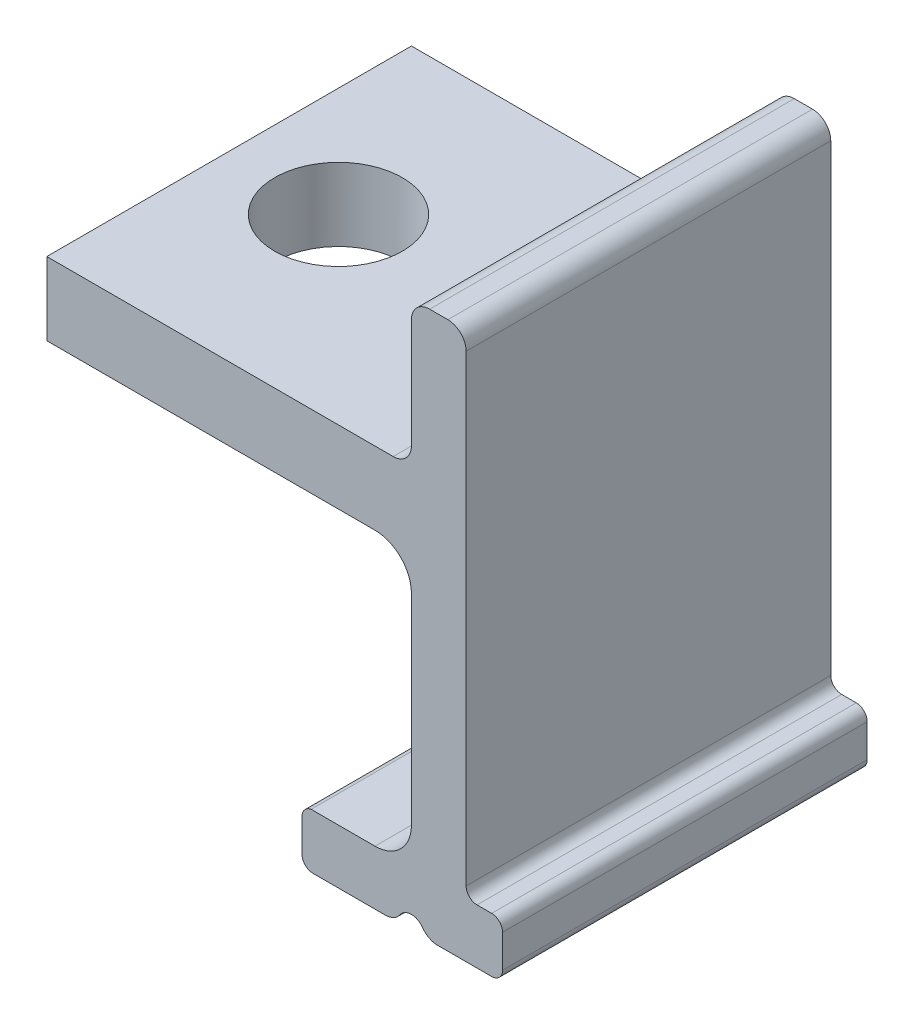
ISO-10303-21;
HEADER;
FILE_DESCRIPTION(('STEP AP214'),'2;1');
FILE_NAME('part.step','',(''),(''),'','','');
FILE_SCHEMA(('AUTOMOTIVE_DESIGN { 1 0 10303 214 1 1 1 1 }'));
ENDSEC;
DATA;
#1=APPLICATION_CONTEXT('core data for automotive mechanical design processes');
#2=APPLICATION_PROTOCOL_DEFINITION('international standard','automotive_design',2000,#1);
#3=PRODUCT_CONTEXT('',#1,'mechanical');
#4=PRODUCT('Part','Part','',(#3));
#5=PRODUCT_RELATED_PRODUCT_CATEGORY('part','',(#4));
#6=PRODUCT_DEFINITION_FORMATION('','',#4);
#7=PRODUCT_DEFINITION_CONTEXT('part definition',#1,'design');
#8=PRODUCT_DEFINITION('design','',#6,#7);
#9=PRODUCT_DEFINITION_SHAPE('','',#8);
#10=(LENGTH_UNIT() NAMED_UNIT(*) SI_UNIT(.MILLI.,.METRE.));
#11=(NAMED_UNIT(*) PLANE_ANGLE_UNIT() SI_UNIT($,.RADIAN.));
#12=(NAMED_UNIT(*) SI_UNIT($,.STERADIAN.) SOLID_ANGLE_UNIT());
#13=UNCERTAINTY_MEASURE_WITH_UNIT(LENGTH_MEASURE(1.E-05),#10,'distance_accuracy_value','');
#14=(GEOMETRIC_REPRESENTATION_CONTEXT(3) GLOBAL_UNCERTAINTY_ASSIGNED_CONTEXT((#13)) GLOBAL_UNIT_ASSIGNED_CONTEXT((#10,
#11,#12)) REPRESENTATION_CONTEXT('',''));
#15=CARTESIAN_POINT('',(0.,0.,0.));
#16=DIRECTION('',(0.,0.,1.));
#17=DIRECTION('',(1.,0.,0.));
#18=AXIS2_PLACEMENT_3D('',#15,#16,#17);
#19=CARTESIAN_POINT('',(0.,-2.,10.));
#20=DIRECTION('',(1.,0.,0.));
#21=DIRECTION('',(0.,0.,-1.));
#22=AXIS2_PLACEMENT_3D('',#19,#20,#21);
#23=PLANE('',#22);
#24=DIRECTION('',(0.,-1.,0.));
#25=VECTOR('',#24,1.);
#26=CARTESIAN_POINT('',(0.,-2.,0.));
#27=LINE('',#26,#25);
#28=CARTESIAN_POINT('',(0.,0.,0.));
#29=VERTEX_POINT('',#28);
#30=CARTESIAN_POINT('',(0.,-2.,0.));
#31=VERTEX_POINT('',#30);
#32=EDGE_CURVE('E241',#29,#31,#27,.T.);
#33=ORIENTED_EDGE('',*,*,#32,.T.);
#34=DIRECTION('',(0.,0.,-1.));
#35=VECTOR('',#34,1.);
#36=CARTESIAN_POINT('',(0.,-2.,10.));
#37=LINE('',#36,#35);
#38=CARTESIAN_POINT('',(0.,-2.,10.));
#39=VERTEX_POINT('',#38);
#40=EDGE_CURVE('E229',#39,#31,#37,.T.);
#41=ORIENTED_EDGE('',*,*,#40,.F.);
#42=DIRECTION('',(0.,-1.,0.));
#43=VECTOR('',#42,1.);
#44=CARTESIAN_POINT('',(0.,-2.,10.));
#45=LINE('',#44,#43);
#46=CARTESIAN_POINT('',(0.,0.,10.));
#47=VERTEX_POINT('',#46);
#48=EDGE_CURVE('E278',#47,#39,#45,.T.);
#49=ORIENTED_EDGE('',*,*,#48,.F.);
#50=DIRECTION('',(0.,0.,-1.));
#51=VECTOR('',#50,1.);
#52=CARTESIAN_POINT('',(0.,0.,10.));
#53=LINE('',#52,#51);
#54=EDGE_CURVE('E279',#47,#29,#53,.T.);
#55=ORIENTED_EDGE('',*,*,#54,.T.);
#56=EDGE_LOOP('',(#33,#41,#49,#55));
#57=FACE_BOUND('',#56,.T.);
#58=ADVANCED_FACE('F38',(#57),#23,.F.);
#59=CARTESIAN_POINT('',(7.3,-2.,10.));
#60=DIRECTION('',(0.,1.,0.));
#61=DIRECTION('',(-1.,0.,0.));
#62=AXIS2_PLACEMENT_3D('',#59,#60,#61);
#63=PLANE('',#62);
#64=CARTESIAN_POINT('',(3.00000000000038,-2.,4.99999999999996));
#65=DIRECTION('',(0.,1.,0.));
#66=DIRECTION('',(-1.,0.,0.));
#67=AXIS2_PLACEMENT_3D('',#64,#65,#66);
#68=CIRCLE('',#67,1.75);
#69=CARTESIAN_POINT('',(1.25000000000038,-2.,4.99999999999996));
#70=VERTEX_POINT('',#69);
#71=EDGE_CURVE('E400',#70,#70,#68,.T.);
#72=ORIENTED_EDGE('',*,*,#71,.T.);
#73=EDGE_LOOP('',(#72));
#74=FACE_BOUND('',#73,.T.);
#75=DIRECTION('',(1.,0.,0.));
#76=VECTOR('',#75,1.);
#77=CARTESIAN_POINT('',(7.3,-2.,0.));
#78=LINE('',#77,#76);
#79=CARTESIAN_POINT('',(9.,-2.,0.));
#80=VERTEX_POINT('',#79);
#81=EDGE_CURVE('E237',#31,#80,#78,.T.);
#82=ORIENTED_EDGE('',*,*,#81,.T.);
#83=DIRECTION('',(0.,0.,1.));
#84=VECTOR('',#83,1.);
#85=CARTESIAN_POINT('',(9.,-2.,0.));
#86=LINE('',#85,#84);
#87=CARTESIAN_POINT('',(9.,-2.,10.));
#88=VERTEX_POINT('',#87);
#89=EDGE_CURVE('E410',#80,#88,#86,.T.);
#90=ORIENTED_EDGE('',*,*,#89,.T.);
#91=DIRECTION('',(1.,0.,0.));
#92=VECTOR('',#91,1.);
#93=CARTESIAN_POINT('',(7.3,-2.,10.));
#94=LINE('',#93,#92);
#95=EDGE_CURVE('E371',#39,#88,#94,.T.);
#96=ORIENTED_EDGE('',*,*,#95,.F.);
#97=ORIENTED_EDGE('',*,*,#40,.T.);
#98=EDGE_LOOP('',(#82,#90,#96,#97));
#99=FACE_BOUND('',#98,.T.);
#100=ADVANCED_FACE('F422',(#74,#99),#63,.F.);
#101=CARTESIAN_POINT('',(7.3,-9.8,10.));
#102=DIRECTION('',(0.,0.,-1.));
#103=DIRECTION('',(-1.,0.,0.));
#104=AXIS2_PLACEMENT_3D('',#101,#102,#103);
#105=CYLINDRICAL_SURFACE('',#104,0.3);
#106=CARTESIAN_POINT('',(7.3,-9.8,0.));
#107=DIRECTION('',(0.,0.,1.));
#108=DIRECTION('',(-1.,0.,0.));
#109=AXIS2_PLACEMENT_3D('',#106,#107,#108);
#110=CIRCLE('',#109,0.3);
#111=CARTESIAN_POINT('',(7.25,-9.50419601084502,0.));
#112=VERTEX_POINT('',#111);
#113=CARTESIAN_POINT('',(7.,-9.8,0.));
#114=VERTEX_POINT('',#113);
#115=EDGE_CURVE('E226',#112,#114,#110,.T.);
#116=ORIENTED_EDGE('',*,*,#115,.T.);
#117=DIRECTION('',(0.,0.,-1.));
#118=VECTOR('',#117,1.);
#119=CARTESIAN_POINT('',(7.,-9.8,10.));
#120=LINE('',#119,#118);
#121=CARTESIAN_POINT('',(7.,-9.8,10.));
#122=VERTEX_POINT('',#121);
#123=EDGE_CURVE('E230',#122,#114,#120,.T.);
#124=ORIENTED_EDGE('',*,*,#123,.F.);
#125=CARTESIAN_POINT('',(7.3,-9.8,10.));
#126=DIRECTION('',(0.,0.,1.));
#127=DIRECTION('',(-1.,0.,0.));
#128=AXIS2_PLACEMENT_3D('',#125,#126,#127);
#129=CIRCLE('',#128,0.3);
#130=CARTESIAN_POINT('',(7.25,-9.50419601084502,10.));
#131=VERTEX_POINT('',#130);
#132=EDGE_CURVE('E228',#131,#122,#129,.T.);
#133=ORIENTED_EDGE('',*,*,#132,.F.);
#134=DIRECTION('',(0.,0.,-1.));
#135=VECTOR('',#134,1.);
#136=CARTESIAN_POINT('',(7.25,-9.50419601084502,10.));
#137=LINE('',#136,#135);
#138=EDGE_CURVE('E215',#131,#112,#137,.T.);
#139=ORIENTED_EDGE('',*,*,#138,.T.);
#140=EDGE_LOOP('',(#116,#124,#133,#139));
#141=FACE_BOUND('',#140,.T.);
#142=ADVANCED_FACE('F224',(#141),#105,.T.);
#143=CARTESIAN_POINT('',(7.,-9.8,10.));
#144=DIRECTION('',(1.,0.,0.));
#145=DIRECTION('',(0.,0.,-1.));
#146=AXIS2_PLACEMENT_3D('',#143,#144,#145);
#147=PLANE('',#146);
#148=DIRECTION('',(0.,-1.,0.));
#149=VECTOR('',#148,1.);
#150=CARTESIAN_POINT('',(7.,-9.8,0.));
#151=LINE('',#150,#149);
#152=CARTESIAN_POINT('',(7.,-10.7,0.));
#153=VERTEX_POINT('',#152);
#154=EDGE_CURVE('E236',#114,#153,#151,.T.);
#155=ORIENTED_EDGE('',*,*,#154,.T.);
#156=DIRECTION('',(0.,0.,-1.));
#157=VECTOR('',#156,1.);
#158=CARTESIAN_POINT('',(7.,-10.7,10.));
#159=LINE('',#158,#157);
#160=CARTESIAN_POINT('',(7.,-10.7,10.));
#161=VERTEX_POINT('',#160);
#162=EDGE_CURVE('E322',#161,#153,#159,.T.);
#163=ORIENTED_EDGE('',*,*,#162,.F.);
#164=DIRECTION('',(0.,-1.,0.));
#165=VECTOR('',#164,1.);
#166=CARTESIAN_POINT('',(7.,-9.8,10.));
#167=LINE('',#166,#165);
#168=EDGE_CURVE('E368',#122,#161,#167,.T.);
#169=ORIENTED_EDGE('',*,*,#168,.F.);
#170=ORIENTED_EDGE('',*,*,#123,.T.);
#171=EDGE_LOOP('',(#155,#163,#169,#170));
#172=FACE_BOUND('',#171,.T.);
#173=ADVANCED_FACE('F367',(#172),#147,.F.);
#174=CARTESIAN_POINT('',(7.3,-10.7,10.));
#175=DIRECTION('',(0.,0.,-1.));
#176=DIRECTION('',(-1.,0.,0.));
#177=AXIS2_PLACEMENT_3D('',#174,#175,#176);
#178=CYLINDRICAL_SURFACE('',#177,0.299999999999999);
#179=CARTESIAN_POINT('',(7.3,-10.7,0.));
#180=DIRECTION('',(0.,0.,1.));
#181=DIRECTION('',(-1.,0.,0.));
#182=AXIS2_PLACEMENT_3D('',#179,#180,#181);
#183=CIRCLE('',#182,0.299999999999999);
#184=CARTESIAN_POINT('',(7.3,-11.,0.));
#185=VERTEX_POINT('',#184);
#186=EDGE_CURVE('E239',#153,#185,#183,.T.);
#187=ORIENTED_EDGE('',*,*,#186,.T.);
#188=DIRECTION('',(0.,0.,-1.));
#189=VECTOR('',#188,1.);
#190=CARTESIAN_POINT('',(7.3,-11.,10.));
#191=LINE('',#190,#189);
#192=CARTESIAN_POINT('',(7.3,-11.,10.));
#193=VERTEX_POINT('',#192);
#194=EDGE_CURVE('E319',#193,#185,#191,.T.);
#195=ORIENTED_EDGE('',*,*,#194,.F.);
#196=CARTESIAN_POINT('',(7.3,-10.7,10.));
#197=DIRECTION('',(0.,0.,1.));
#198=DIRECTION('',(-1.,0.,0.));
#199=AXIS2_PLACEMENT_3D('',#196,#197,#198);
#200=CIRCLE('',#199,0.299999999999999);
#201=EDGE_CURVE('E363',#161,#193,#200,.T.);
#202=ORIENTED_EDGE('',*,*,#201,.F.);
#203=ORIENTED_EDGE('',*,*,#162,.T.);
#204=EDGE_LOOP('',(#187,#195,#202,#203));
#205=FACE_BOUND('',#204,.T.);
#206=ADVANCED_FACE('F362',(#205),#178,.T.);
#207=CARTESIAN_POINT('',(9.625,-11.,10.));
#208=DIRECTION('',(0.,1.,0.));
#209=DIRECTION('',(0.,0.,1.));
#210=AXIS2_PLACEMENT_3D('',#207,#208,#209);
#211=PLANE('',#210);
#212=DIRECTION('',(1.,0.,0.));
#213=VECTOR('',#212,1.);
#214=CARTESIAN_POINT('',(9.625,-11.,0.));
#215=LINE('',#214,#213);
#216=CARTESIAN_POINT('',(9.28192966918275,-11.,0.));
#217=VERTEX_POINT('',#216);
#218=EDGE_CURVE('E246',#185,#217,#215,.T.);
#219=ORIENTED_EDGE('',*,*,#218,.T.);
#220=DIRECTION('',(0.,0.,-1.));
#221=VECTOR('',#220,1.);
#222=CARTESIAN_POINT('',(9.28192966918275,-11.,10.));
#223=LINE('',#222,#221);
#224=CARTESIAN_POINT('',(9.28192966918275,-11.,10.));
#225=VERTEX_POINT('',#224);
#226=EDGE_CURVE('E337',#217,#225,#223,.F.);
#227=ORIENTED_EDGE('',*,*,#226,.T.);
#228=DIRECTION('',(1.,0.,0.));
#229=VECTOR('',#228,1.);
#230=CARTESIAN_POINT('',(9.625,-11.,10.));
#231=LINE('',#230,#229);
#232=EDGE_CURVE('E345',#193,#225,#231,.T.);
#233=ORIENTED_EDGE('',*,*,#232,.F.);
#234=ORIENTED_EDGE('',*,*,#194,.T.);
#235=EDGE_LOOP('',(#219,#227,#233,#234));
#236=FACE_BOUND('',#235,.T.);
#237=ADVANCED_FACE('F358',(#236),#211,.F.);
#238=CARTESIAN_POINT('',(10.,-11.,10.));
#239=DIRECTION('',(0.,0.,-1.));
#240=DIRECTION('',(-1.,0.,0.));
#241=AXIS2_PLACEMENT_3D('',#238,#239,#240);
#242=CYLINDRICAL_SURFACE('',#241,0.375);
#243=CARTESIAN_POINT('',(10.,-11.,10.));
#244=DIRECTION('',(0.,0.,-1.));
#245=DIRECTION('',(1.,0.,0.));
#246=AXIS2_PLACEMENT_3D('',#243,#244,#245);
#247=CIRCLE('',#246,0.375);
#248=CARTESIAN_POINT('',(9.69225557250689,-10.7857142857143,10.));
#249=VERTEX_POINT('',#248);
#250=CARTESIAN_POINT('',(10.3077444274931,-10.7857142857143,10.));
#251=VERTEX_POINT('',#250);
#252=EDGE_CURVE('E343',#249,#251,#247,.T.);
#253=ORIENTED_EDGE('',*,*,#252,.F.);
#254=DIRECTION('',(0.,0.,-1.));
#255=VECTOR('',#254,1.);
#256=CARTESIAN_POINT('',(9.69225557250689,-10.7857142857143,10.));
#257=LINE('',#256,#255);
#258=CARTESIAN_POINT('',(9.69225557250689,-10.7857142857143,0.));
#259=VERTEX_POINT('',#258);
#260=EDGE_CURVE('E330',#249,#259,#257,.T.);
#261=ORIENTED_EDGE('',*,*,#260,.T.);
#262=CARTESIAN_POINT('',(10.,-11.,0.));
#263=DIRECTION('',(0.,0.,-1.));
#264=DIRECTION('',(1.,0.,0.));
#265=AXIS2_PLACEMENT_3D('',#262,#263,#264);
#266=CIRCLE('',#265,0.375);
#267=CARTESIAN_POINT('',(10.3077444274931,-10.7857142857143,0.));
#268=VERTEX_POINT('',#267);
#269=EDGE_CURVE('E249',#259,#268,#266,.T.);
#270=ORIENTED_EDGE('',*,*,#269,.T.);
#271=DIRECTION('',(0.,0.,-1.));
#272=VECTOR('',#271,1.);
#273=CARTESIAN_POINT('',(10.3077444274931,-10.7857142857143,10.));
#274=LINE('',#273,#272);
#275=EDGE_CURVE('E328',#268,#251,#274,.F.);
#276=ORIENTED_EDGE('',*,*,#275,.T.);
#277=EDGE_LOOP('',(#253,#261,#270,#276));
#278=FACE_BOUND('',#277,.T.);
#279=ADVANCED_FACE('F350',(#278),#242,.F.);
#280=CARTESIAN_POINT('',(12.2,-11.,10.));
#281=DIRECTION('',(0.,1.,0.));
#282=DIRECTION('',(-1.,0.,0.));
#283=AXIS2_PLACEMENT_3D('',#280,#281,#282);
#284=PLANE('',#283);
#285=DIRECTION('',(1.,0.,0.));
#286=VECTOR('',#285,1.);
#287=CARTESIAN_POINT('',(12.2,-11.,10.));
#288=LINE('',#287,#286);
#289=CARTESIAN_POINT('',(10.7180703308173,-11.,10.));
#290=VERTEX_POINT('',#289);
#291=CARTESIAN_POINT('',(12.2,-11.,10.));
#292=VERTEX_POINT('',#291);
#293=EDGE_CURVE('E353',#290,#292,#288,.T.);
#294=ORIENTED_EDGE('',*,*,#293,.F.);
#295=DIRECTION('',(0.,0.,-1.));
#296=VECTOR('',#295,1.);
#297=CARTESIAN_POINT('',(10.7180703308173,-11.,10.));
#298=LINE('',#297,#296);
#299=CARTESIAN_POINT('',(10.7180703308173,-11.,0.));
#300=VERTEX_POINT('',#299);
#301=EDGE_CURVE('E11',#290,#300,#298,.T.);
#302=ORIENTED_EDGE('',*,*,#301,.T.);
#303=DIRECTION('',(1.,0.,0.));
#304=VECTOR('',#303,1.);
#305=CARTESIAN_POINT('',(12.2,-11.,0.));
#306=LINE('',#305,#304);
#307=CARTESIAN_POINT('',(12.2,-11.,0.));
#308=VERTEX_POINT('',#307);
#309=EDGE_CURVE('E252',#300,#308,#306,.T.);
#310=ORIENTED_EDGE('',*,*,#309,.T.);
#311=DIRECTION('',(0.,0.,-1.));
#312=VECTOR('',#311,1.);
#313=CARTESIAN_POINT('',(12.2,-11.,10.));
#314=LINE('',#313,#312);
#315=EDGE_CURVE('E316',#292,#308,#314,.T.);
#316=ORIENTED_EDGE('',*,*,#315,.F.);
#317=EDGE_LOOP('',(#294,#302,#310,#316));
#318=FACE_BOUND('',#317,.T.);
#319=ADVANCED_FACE('F527',(#318),#284,.F.);
#320=CARTESIAN_POINT('',(12.2,-10.7,10.));
#321=DIRECTION('',(0.,0.,-1.));
#322=DIRECTION('',(-1.,0.,0.));
#323=AXIS2_PLACEMENT_3D('',#320,#321,#322);
#324=CYLINDRICAL_SURFACE('',#323,0.3);
#325=CARTESIAN_POINT('',(12.2,-10.7,0.));
#326=DIRECTION('',(0.,0.,1.));
#327=DIRECTION('',(-1.,0.,0.));
#328=AXIS2_PLACEMENT_3D('',#325,#326,#327);
#329=CIRCLE('',#328,0.3);
#330=CARTESIAN_POINT('',(12.5,-10.7,0.));
#331=VERTEX_POINT('',#330);
#332=EDGE_CURVE('E254',#308,#331,#329,.T.);
#333=ORIENTED_EDGE('',*,*,#332,.T.);
#334=DIRECTION('',(0.,0.,-1.));
#335=VECTOR('',#334,1.);
#336=CARTESIAN_POINT('',(12.5,-10.7,10.));
#337=LINE('',#336,#335);
#338=CARTESIAN_POINT('',(12.5,-10.7,10.));
#339=VERTEX_POINT('',#338);
#340=EDGE_CURVE('E313',#339,#331,#337,.T.);
#341=ORIENTED_EDGE('',*,*,#340,.F.);
#342=CARTESIAN_POINT('',(12.2,-10.7,10.));
#343=DIRECTION('',(0.,0.,1.));
#344=DIRECTION('',(-1.,0.,0.));
#345=AXIS2_PLACEMENT_3D('',#342,#343,#344);
#346=CIRCLE('',#345,0.3);
#347=EDGE_CURVE('E377',#292,#339,#346,.T.);
#348=ORIENTED_EDGE('',*,*,#347,.F.);
#349=ORIENTED_EDGE('',*,*,#315,.T.);
#350=EDGE_LOOP('',(#333,#341,#348,#349));
#351=FACE_BOUND('',#350,.T.);
#352=ADVANCED_FACE('F523',(#351),#324,.T.);
#353=CARTESIAN_POINT('',(12.5,-10.7,10.));
#354=DIRECTION('',(-1.,0.,0.));
#355=DIRECTION('',(0.,0.,1.));
#356=AXIS2_PLACEMENT_3D('',#353,#354,#355);
#357=PLANE('',#356);
#358=DIRECTION('',(0.,1.,0.));
#359=VECTOR('',#358,1.);
#360=CARTESIAN_POINT('',(12.5,-10.7,0.));
#361=LINE('',#360,#359);
#362=CARTESIAN_POINT('',(12.5,-9.8,0.));
#363=VERTEX_POINT('',#362);
#364=EDGE_CURVE('E256',#331,#363,#361,.T.);
#365=ORIENTED_EDGE('',*,*,#364,.T.);
#366=DIRECTION('',(0.,0.,-1.));
#367=VECTOR('',#366,1.);
#368=CARTESIAN_POINT('',(12.5,-9.8,10.));
#369=LINE('',#368,#367);
#370=CARTESIAN_POINT('',(12.5,-9.8,10.));
#371=VERTEX_POINT('',#370);
#372=EDGE_CURVE('E310',#371,#363,#369,.T.);
#373=ORIENTED_EDGE('',*,*,#372,.F.);
#374=DIRECTION('',(0.,1.,0.));
#375=VECTOR('',#374,1.);
#376=CARTESIAN_POINT('',(12.5,-10.7,10.));
#377=LINE('',#376,#375);
#378=EDGE_CURVE('E379',#339,#371,#377,.T.);
#379=ORIENTED_EDGE('',*,*,#378,.F.);
#380=ORIENTED_EDGE('',*,*,#340,.T.);
#381=EDGE_LOOP('',(#365,#373,#379,#380));
#382=FACE_BOUND('',#381,.T.);
#383=ADVANCED_FACE('F519',(#382),#357,.F.);
#384=CARTESIAN_POINT('',(12.2,-9.8,10.));
#385=DIRECTION('',(0.,0.,-1.));
#386=DIRECTION('',(-1.,0.,0.));
#387=AXIS2_PLACEMENT_3D('',#384,#385,#386);
#388=CYLINDRICAL_SURFACE('',#387,0.3);
#389=CARTESIAN_POINT('',(12.2,-9.8,0.));
#390=DIRECTION('',(0.,0.,1.));
#391=DIRECTION('',(1.,0.,0.));
#392=AXIS2_PLACEMENT_3D('',#389,#390,#391);
#393=CIRCLE('',#392,0.3);
#394=CARTESIAN_POINT('',(12.2,-9.5,0.));
#395=VERTEX_POINT('',#394);
#396=EDGE_CURVE('E258',#363,#395,#393,.T.);
#397=ORIENTED_EDGE('',*,*,#396,.T.);
#398=DIRECTION('',(0.,0.,-1.));
#399=VECTOR('',#398,1.);
#400=CARTESIAN_POINT('',(12.2,-9.5,10.));
#401=LINE('',#400,#399);
#402=CARTESIAN_POINT('',(12.2,-9.5,10.));
#403=VERTEX_POINT('',#402);
#404=EDGE_CURVE('E307',#403,#395,#401,.T.);
#405=ORIENTED_EDGE('',*,*,#404,.F.);
#406=CARTESIAN_POINT('',(12.2,-9.8,10.));
#407=DIRECTION('',(0.,0.,1.));
#408=DIRECTION('',(1.,0.,0.));
#409=AXIS2_PLACEMENT_3D('',#406,#407,#408);
#410=CIRCLE('',#409,0.3);
#411=EDGE_CURVE('E381',#371,#403,#410,.T.);
#412=ORIENTED_EDGE('',*,*,#411,.F.);
#413=ORIENTED_EDGE('',*,*,#372,.T.);
#414=EDGE_LOOP('',(#397,#405,#412,#413));
#415=FACE_BOUND('',#414,.T.);
#416=ADVANCED_FACE('F515',(#415),#388,.T.);
#417=CARTESIAN_POINT('',(12.2,-9.5,10.));
#418=DIRECTION('',(0.,-1.,0.));
#419=DIRECTION('',(0.,0.,-1.));
#420=AXIS2_PLACEMENT_3D('',#417,#418,#419);
#421=PLANE('',#420);
#422=DIRECTION('',(-1.,0.,0.));
#423=VECTOR('',#422,1.);
#424=CARTESIAN_POINT('',(12.2,-9.5,0.));
#425=LINE('',#424,#423);
#426=CARTESIAN_POINT('',(11.8,-9.5,0.));
#427=VERTEX_POINT('',#426);
#428=EDGE_CURVE('E260',#395,#427,#425,.T.);
#429=ORIENTED_EDGE('',*,*,#428,.T.);
#430=DIRECTION('',(0.,0.,-1.));
#431=VECTOR('',#430,1.);
#432=CARTESIAN_POINT('',(11.8,-9.5,10.));
#433=LINE('',#432,#431);
#434=CARTESIAN_POINT('',(11.8,-9.5,10.));
#435=VERTEX_POINT('',#434);
#436=EDGE_CURVE('E304',#435,#427,#433,.T.);
#437=ORIENTED_EDGE('',*,*,#436,.F.);
#438=DIRECTION('',(-1.,0.,0.));
#439=VECTOR('',#438,1.);
#440=CARTESIAN_POINT('',(12.2,-9.5,10.));
#441=LINE('',#440,#439);
#442=EDGE_CURVE('E383',#403,#435,#441,.T.);
#443=ORIENTED_EDGE('',*,*,#442,.F.);
#444=ORIENTED_EDGE('',*,*,#404,.T.);
#445=EDGE_LOOP('',(#429,#437,#443,#444));
#446=FACE_BOUND('',#445,.T.);
#447=ADVANCED_FACE('F511',(#446),#421,.F.);
#448=CARTESIAN_POINT('',(11.8,-9.2,10.));
#449=DIRECTION('',(0.,0.,-1.));
#450=DIRECTION('',(-1.,0.,0.));
#451=AXIS2_PLACEMENT_3D('',#448,#449,#450);
#452=CYLINDRICAL_SURFACE('',#451,0.300000000000001);
#453=CARTESIAN_POINT('',(11.8,-9.2,0.));
#454=DIRECTION('',(0.,0.,-1.));
#455=DIRECTION('',(-1.,0.,0.));
#456=AXIS2_PLACEMENT_3D('',#453,#454,#455);
#457=CIRCLE('',#456,0.300000000000001);
#458=CARTESIAN_POINT('',(11.5,-9.2,0.));
#459=VERTEX_POINT('',#458);
#460=EDGE_CURVE('E262',#427,#459,#457,.T.);
#461=ORIENTED_EDGE('',*,*,#460,.T.);
#462=DIRECTION('',(0.,0.,-1.));
#463=VECTOR('',#462,1.);
#464=CARTESIAN_POINT('',(11.5,-9.2,10.));
#465=LINE('',#464,#463);
#466=CARTESIAN_POINT('',(11.5,-9.2,10.));
#467=VERTEX_POINT('',#466);
#468=EDGE_CURVE('E301',#467,#459,#465,.T.);
#469=ORIENTED_EDGE('',*,*,#468,.F.);
#470=CARTESIAN_POINT('',(11.8,-9.2,10.));
#471=DIRECTION('',(0.,0.,-1.));
#472=DIRECTION('',(-1.,0.,0.));
#473=AXIS2_PLACEMENT_3D('',#470,#471,#472);
#474=CIRCLE('',#473,0.300000000000001);
#475=EDGE_CURVE('E385',#435,#467,#474,.T.);
#476=ORIENTED_EDGE('',*,*,#475,.F.);
#477=ORIENTED_EDGE('',*,*,#436,.T.);
#478=EDGE_LOOP('',(#461,#469,#476,#477));
#479=FACE_BOUND('',#478,.T.);
#480=ADVANCED_FACE('F507',(#479),#452,.F.);
#481=CARTESIAN_POINT('',(11.5,-9.2,10.));
#482=DIRECTION('',(-1.,0.,0.));
#483=DIRECTION('',(0.,-1.,0.));
#484=AXIS2_PLACEMENT_3D('',#481,#482,#483);
#485=PLANE('',#484);
#486=DIRECTION('',(0.,1.,0.));
#487=VECTOR('',#486,1.);
#488=CARTESIAN_POINT('',(11.5,-9.2,0.));
#489=LINE('',#488,#487);
#490=CARTESIAN_POINT('',(11.5,3.5,0.));
#491=VERTEX_POINT('',#490);
#492=EDGE_CURVE('E264',#459,#491,#489,.T.);
#493=ORIENTED_EDGE('',*,*,#492,.T.);
#494=DIRECTION('',(0.,0.,-1.));
#495=VECTOR('',#494,1.);
#496=CARTESIAN_POINT('',(11.5,3.5,10.));
#497=LINE('',#496,#495);
#498=CARTESIAN_POINT('',(11.5,3.5,10.));
#499=VERTEX_POINT('',#498);
#500=EDGE_CURVE('E298',#499,#491,#497,.T.);
#501=ORIENTED_EDGE('',*,*,#500,.F.);
#502=DIRECTION('',(0.,1.,0.));
#503=VECTOR('',#502,1.);
#504=CARTESIAN_POINT('',(11.5,-9.2,10.));
#505=LINE('',#504,#503);
#506=EDGE_CURVE('E387',#467,#499,#505,.T.);
#507=ORIENTED_EDGE('',*,*,#506,.F.);
#508=ORIENTED_EDGE('',*,*,#468,.T.);
#509=EDGE_LOOP('',(#493,#501,#507,#508));
#510=FACE_BOUND('',#509,.T.);
#511=ADVANCED_FACE('F503',(#510),#485,.F.);
#512=CARTESIAN_POINT('',(11.,3.5,10.));
#513=DIRECTION('',(0.,0.,-1.));
#514=DIRECTION('',(-1.,0.,0.));
#515=AXIS2_PLACEMENT_3D('',#512,#513,#514);
#516=CYLINDRICAL_SURFACE('',#515,0.500000000000002);
#517=CARTESIAN_POINT('',(11.,3.5,0.));
#518=DIRECTION('',(0.,0.,1.));
#519=DIRECTION('',(1.,0.,0.));
#520=AXIS2_PLACEMENT_3D('',#517,#518,#519);
#521=CIRCLE('',#520,0.500000000000002);
#522=CARTESIAN_POINT('',(11.,4.,0.));
#523=VERTEX_POINT('',#522);
#524=EDGE_CURVE('E266',#491,#523,#521,.T.);
#525=ORIENTED_EDGE('',*,*,#524,.T.);
#526=DIRECTION('',(0.,0.,-1.));
#527=VECTOR('',#526,1.);
#528=CARTESIAN_POINT('',(11.,4.,10.));
#529=LINE('',#528,#527);
#530=CARTESIAN_POINT('',(11.,4.,10.));
#531=VERTEX_POINT('',#530);
#532=EDGE_CURVE('E295',#531,#523,#529,.T.);
#533=ORIENTED_EDGE('',*,*,#532,.F.);
#534=CARTESIAN_POINT('',(11.,3.5,10.));
#535=DIRECTION('',(0.,0.,1.));
#536=DIRECTION('',(1.,0.,0.));
#537=AXIS2_PLACEMENT_3D('',#534,#535,#536);
#538=CIRCLE('',#537,0.500000000000002);
#539=EDGE_CURVE('E389',#499,#531,#538,.T.);
#540=ORIENTED_EDGE('',*,*,#539,.F.);
#541=ORIENTED_EDGE('',*,*,#500,.T.);
#542=EDGE_LOOP('',(#525,#533,#540,#541));
#543=FACE_BOUND('',#542,.T.);
#544=ADVANCED_FACE('F499',(#543),#516,.T.);
#545=CARTESIAN_POINT('',(11.,4.,10.));
#546=DIRECTION('',(0.,-1.,0.));
#547=DIRECTION('',(1.,0.,0.));
#548=AXIS2_PLACEMENT_3D('',#545,#546,#547);
#549=PLANE('',#548);
#550=DIRECTION('',(-1.,0.,0.));
#551=VECTOR('',#550,1.);
#552=CARTESIAN_POINT('',(11.,4.,0.));
#553=LINE('',#552,#551);
#554=CARTESIAN_POINT('',(10.5,4.,0.));
#555=VERTEX_POINT('',#554);
#556=EDGE_CURVE('E268',#523,#555,#553,.T.);
#557=ORIENTED_EDGE('',*,*,#556,.T.);
#558=DIRECTION('',(0.,0.,-1.));
#559=VECTOR('',#558,1.);
#560=CARTESIAN_POINT('',(10.5,4.,10.));
#561=LINE('',#560,#559);
#562=CARTESIAN_POINT('',(10.5,4.,10.));
#563=VERTEX_POINT('',#562);
#564=EDGE_CURVE('E292',#563,#555,#561,.T.);
#565=ORIENTED_EDGE('',*,*,#564,.F.);
#566=DIRECTION('',(-1.,0.,0.));
#567=VECTOR('',#566,1.);
#568=CARTESIAN_POINT('',(11.,4.,10.));
#569=LINE('',#568,#567);
#570=EDGE_CURVE('E391',#531,#563,#569,.T.);
#571=ORIENTED_EDGE('',*,*,#570,.F.);
#572=ORIENTED_EDGE('',*,*,#532,.T.);
#573=EDGE_LOOP('',(#557,#565,#571,#572));
#574=FACE_BOUND('',#573,.T.);
#575=ADVANCED_FACE('F495',(#574),#549,.F.);
#576=CARTESIAN_POINT('',(10.5,3.5,10.));
#577=DIRECTION('',(0.,0.,-1.));
#578=DIRECTION('',(-1.,0.,0.));
#579=AXIS2_PLACEMENT_3D('',#576,#577,#578);
#580=CYLINDRICAL_SURFACE('',#579,0.500000000000001);
#581=CARTESIAN_POINT('',(10.5,3.5,0.));
#582=DIRECTION('',(0.,0.,1.));
#583=DIRECTION('',(1.,0.,0.));
#584=AXIS2_PLACEMENT_3D('',#581,#582,#583);
#585=CIRCLE('',#584,0.500000000000001);
#586=CARTESIAN_POINT('',(10.,3.5,0.));
#587=VERTEX_POINT('',#586);
#588=EDGE_CURVE('E270',#555,#587,#585,.T.);
#589=ORIENTED_EDGE('',*,*,#588,.T.);
#590=DIRECTION('',(0.,0.,-1.));
#591=VECTOR('',#590,1.);
#592=CARTESIAN_POINT('',(10.,3.5,10.));
#593=LINE('',#592,#591);
#594=CARTESIAN_POINT('',(10.,3.5,10.));
#595=VERTEX_POINT('',#594);
#596=EDGE_CURVE('E289',#595,#587,#593,.T.);
#597=ORIENTED_EDGE('',*,*,#596,.F.);
#598=CARTESIAN_POINT('',(10.5,3.5,10.));
#599=DIRECTION('',(0.,0.,1.));
#600=DIRECTION('',(1.,0.,0.));
#601=AXIS2_PLACEMENT_3D('',#598,#599,#600);
#602=CIRCLE('',#601,0.500000000000001);
#603=EDGE_CURVE('E393',#563,#595,#602,.T.);
#604=ORIENTED_EDGE('',*,*,#603,.F.);
#605=ORIENTED_EDGE('',*,*,#564,.T.);
#606=EDGE_LOOP('',(#589,#597,#604,#605));
#607=FACE_BOUND('',#606,.T.);
#608=ADVANCED_FACE('F491',(#607),#580,.T.);
#609=CARTESIAN_POINT('',(10.,3.5,10.));
#610=DIRECTION('',(1.,0.,0.));
#611=DIRECTION('',(0.,1.,0.));
#612=AXIS2_PLACEMENT_3D('',#609,#610,#611);
#613=PLANE('',#612);
#614=DIRECTION('',(0.,-1.,0.));
#615=VECTOR('',#614,1.);
#616=CARTESIAN_POINT('',(10.,3.5,0.));
#617=LINE('',#616,#615);
#618=CARTESIAN_POINT('',(10.,0.500000000000001,0.));
#619=VERTEX_POINT('',#618);
#620=EDGE_CURVE('E272',#587,#619,#617,.T.);
#621=ORIENTED_EDGE('',*,*,#620,.T.);
#622=DIRECTION('',(0.,0.,-1.));
#623=VECTOR('',#622,1.);
#624=CARTESIAN_POINT('',(10.,0.500000000000001,10.));
#625=LINE('',#624,#623);
#626=CARTESIAN_POINT('',(10.,0.500000000000001,10.));
#627=VERTEX_POINT('',#626);
#628=EDGE_CURVE('E286',#627,#619,#625,.T.);
#629=ORIENTED_EDGE('',*,*,#628,.F.);
#630=DIRECTION('',(0.,-1.,0.));
#631=VECTOR('',#630,1.);
#632=CARTESIAN_POINT('',(10.,3.5,10.));
#633=LINE('',#632,#631);
#634=EDGE_CURVE('E395',#595,#627,#633,.T.);
#635=ORIENTED_EDGE('',*,*,#634,.F.);
#636=ORIENTED_EDGE('',*,*,#596,.T.);
#637=EDGE_LOOP('',(#621,#629,#635,#636));
#638=FACE_BOUND('',#637,.T.);
#639=ADVANCED_FACE('F487',(#638),#613,.F.);
#640=CARTESIAN_POINT('',(9.5,0.500000000000001,10.));
#641=DIRECTION('',(0.,0.,-1.));
#642=DIRECTION('',(-1.,0.,0.));
#643=AXIS2_PLACEMENT_3D('',#640,#641,#642);
#644=CYLINDRICAL_SURFACE('',#643,0.5);
#645=CARTESIAN_POINT('',(9.5,0.500000000000001,0.));
#646=DIRECTION('',(0.,0.,-1.));
#647=DIRECTION('',(-1.,0.,0.));
#648=AXIS2_PLACEMENT_3D('',#645,#646,#647);
#649=CIRCLE('',#648,0.5);
#650=CARTESIAN_POINT('',(9.5,0.,0.));
#651=VERTEX_POINT('',#650);
#652=EDGE_CURVE('E274',#619,#651,#649,.T.);
#653=ORIENTED_EDGE('',*,*,#652,.T.);
#654=DIRECTION('',(0.,0.,-1.));
#655=VECTOR('',#654,1.);
#656=CARTESIAN_POINT('',(9.5,0.,10.));
#657=LINE('',#656,#655);
#658=CARTESIAN_POINT('',(9.5,0.,10.));
#659=VERTEX_POINT('',#658);
#660=EDGE_CURVE('E282',#659,#651,#657,.T.);
#661=ORIENTED_EDGE('',*,*,#660,.F.);
#662=CARTESIAN_POINT('',(9.5,0.500000000000001,10.));
#663=DIRECTION('',(0.,0.,-1.));
#664=DIRECTION('',(-1.,0.,0.));
#665=AXIS2_PLACEMENT_3D('',#662,#663,#664);
#666=CIRCLE('',#665,0.5);
#667=EDGE_CURVE('E397',#627,#659,#666,.T.);
#668=ORIENTED_EDGE('',*,*,#667,.F.);
#669=ORIENTED_EDGE('',*,*,#628,.T.);
#670=EDGE_LOOP('',(#653,#661,#668,#669));
#671=FACE_BOUND('',#670,.T.);
#672=ADVANCED_FACE('F483',(#671),#644,.F.);
#673=CARTESIAN_POINT('',(0.,0.,10.));
#674=DIRECTION('',(0.,-1.,0.));
#675=DIRECTION('',(0.,0.,-1.));
#676=AXIS2_PLACEMENT_3D('',#673,#674,#675);
#677=PLANE('',#676);
#678=CARTESIAN_POINT('',(3.00000000000038,0.,4.99999999999996));
#679=DIRECTION('',(0.,1.,0.));
#680=DIRECTION('',(0.,0.,1.));
#681=AXIS2_PLACEMENT_3D('',#678,#679,#680);
#682=CIRCLE('',#681,1.75);
#683=CARTESIAN_POINT('',(3.00000000000038,0.,6.74999999999995));
#684=VERTEX_POINT('',#683);
#685=EDGE_CURVE('E405',#684,#684,#682,.T.);
#686=ORIENTED_EDGE('',*,*,#685,.F.);
#687=EDGE_LOOP('',(#686));
#688=FACE_BOUND('',#687,.T.);
#689=DIRECTION('',(-1.,0.,0.));
#690=VECTOR('',#689,1.);
#691=CARTESIAN_POINT('',(0.,0.,0.));
#692=LINE('',#691,#690);
#693=EDGE_CURVE('E276',#651,#29,#692,.T.);
#694=ORIENTED_EDGE('',*,*,#693,.T.);
#695=ORIENTED_EDGE('',*,*,#54,.F.);
#696=DIRECTION('',(-1.,0.,0.));
#697=VECTOR('',#696,1.);
#698=CARTESIAN_POINT('',(0.,0.,10.));
#699=LINE('',#698,#697);
#700=EDGE_CURVE('E283',#659,#47,#699,.T.);
#701=ORIENTED_EDGE('',*,*,#700,.F.);
#702=ORIENTED_EDGE('',*,*,#660,.T.);
#703=EDGE_LOOP('',(#694,#695,#701,#702));
#704=FACE_BOUND('',#703,.T.);
#705=ADVANCED_FACE('F477',(#688,#704),#677,.F.);
#706=CARTESIAN_POINT('',(9.5,0.500000000000001,10.));
#707=DIRECTION('',(0.,0.,-1.));
#708=DIRECTION('',(-1.,0.,0.));
#709=AXIS2_PLACEMENT_3D('',#706,#707,#708);
#710=PLANE('',#709);
#711=ORIENTED_EDGE('',*,*,#95,.T.);
#712=CARTESIAN_POINT('',(9.,-3.,10.));
#713=DIRECTION('',(0.,0.,1.));
#714=DIRECTION('',(1.,0.,0.));
#715=AXIS2_PLACEMENT_3D('',#712,#713,#714);
#716=CIRCLE('',#715,1.);
#717=CARTESIAN_POINT('',(10.,-3.,10.));
#718=VERTEX_POINT('',#717);
#719=EDGE_CURVE('E220',#718,#88,#716,.T.);
#720=ORIENTED_EDGE('',*,*,#719,.F.);
#721=DIRECTION('',(0.,1.,0.));
#722=VECTOR('',#721,1.);
#723=CARTESIAN_POINT('',(10.,-8.50419601084502,10.));
#724=LINE('',#723,#722);
#725=CARTESIAN_POINT('',(10.,-8.50419601084502,10.));
#726=VERTEX_POINT('',#725);
#727=EDGE_CURVE('E429',#726,#718,#724,.T.);
#728=ORIENTED_EDGE('',*,*,#727,.F.);
#729=CARTESIAN_POINT('',(9.,-8.50419601084502,10.));
#730=DIRECTION('',(0.,0.,1.));
#731=DIRECTION('',(1.,0.,0.));
#732=AXIS2_PLACEMENT_3D('',#729,#730,#731);
#733=CIRCLE('',#732,1.);
#734=CARTESIAN_POINT('',(9.,-9.50419601084502,10.));
#735=VERTEX_POINT('',#734);
#736=EDGE_CURVE('E431',#735,#726,#733,.T.);
#737=ORIENTED_EDGE('',*,*,#736,.F.);
#738=DIRECTION('',(1.,0.,0.));
#739=VECTOR('',#738,1.);
#740=CARTESIAN_POINT('',(7.25,-9.50419601084502,10.));
#741=LINE('',#740,#739);
#742=EDGE_CURVE('E445',#131,#735,#741,.T.);
#743=ORIENTED_EDGE('',*,*,#742,.F.);
#744=ORIENTED_EDGE('',*,*,#132,.T.);
#745=ORIENTED_EDGE('',*,*,#168,.T.);
#746=ORIENTED_EDGE('',*,*,#201,.T.);
#747=ORIENTED_EDGE('',*,*,#232,.T.);
#748=CARTESIAN_POINT('',(9.28192966918275,-10.5,10.));
#749=DIRECTION('',(0.,0.,-1.));
#750=DIRECTION('',(-1.,0.,0.));
#751=AXIS2_PLACEMENT_3D('',#748,#749,#750);
#752=CIRCLE('',#751,0.5);
#753=EDGE_CURVE('E46',#225,#249,#752,.F.);
#754=ORIENTED_EDGE('',*,*,#753,.T.);
#755=ORIENTED_EDGE('',*,*,#252,.T.);
#756=CARTESIAN_POINT('',(10.7180703308173,-10.5,10.));
#757=DIRECTION('',(0.,0.,-1.));
#758=DIRECTION('',(-1.,0.,0.));
#759=AXIS2_PLACEMENT_3D('',#756,#757,#758);
#760=CIRCLE('',#759,0.5);
#761=EDGE_CURVE('E61',#251,#290,#760,.F.);
#762=ORIENTED_EDGE('',*,*,#761,.T.);
#763=ORIENTED_EDGE('',*,*,#293,.T.);
#764=ORIENTED_EDGE('',*,*,#347,.T.);
#765=ORIENTED_EDGE('',*,*,#378,.T.);
#766=ORIENTED_EDGE('',*,*,#411,.T.);
#767=ORIENTED_EDGE('',*,*,#442,.T.);
#768=ORIENTED_EDGE('',*,*,#475,.T.);
#769=ORIENTED_EDGE('',*,*,#506,.T.);
#770=ORIENTED_EDGE('',*,*,#539,.T.);
#771=ORIENTED_EDGE('',*,*,#570,.T.);
#772=ORIENTED_EDGE('',*,*,#603,.T.);
#773=ORIENTED_EDGE('',*,*,#634,.T.);
#774=ORIENTED_EDGE('',*,*,#667,.T.);
#775=ORIENTED_EDGE('',*,*,#700,.T.);
#776=ORIENTED_EDGE('',*,*,#48,.T.);
#777=EDGE_LOOP('',(#711,#720,#728,#737,#743,#744,#745,#746,#747,#754,#755,#762,#763,#764,#765,
#766,#767,#768,#769,#770,#771,#772,#773,#774,#775,#776));
#778=FACE_BOUND('',#777,.T.);
#779=ADVANCED_FACE('F342',(#778),#710,.F.);
#780=CARTESIAN_POINT('',(9.5,0.500000000000001,0.));
#781=DIRECTION('',(0.,0.,-1.));
#782=DIRECTION('',(-1.,0.,0.));
#783=AXIS2_PLACEMENT_3D('',#780,#781,#782);
#784=PLANE('',#783);
#785=CARTESIAN_POINT('',(9.,-3.,0.));
#786=DIRECTION('',(0.,0.,1.));
#787=DIRECTION('',(1.,0.,0.));
#788=AXIS2_PLACEMENT_3D('',#785,#786,#787);
#789=CIRCLE('',#788,1.);
#790=CARTESIAN_POINT('',(10.,-3.,0.));
#791=VERTEX_POINT('',#790);
#792=EDGE_CURVE('E437',#791,#80,#789,.T.);
#793=ORIENTED_EDGE('',*,*,#792,.T.);
#794=ORIENTED_EDGE('',*,*,#81,.F.);
#795=ORIENTED_EDGE('',*,*,#32,.F.);
#796=ORIENTED_EDGE('',*,*,#693,.F.);
#797=ORIENTED_EDGE('',*,*,#652,.F.);
#798=ORIENTED_EDGE('',*,*,#620,.F.);
#799=ORIENTED_EDGE('',*,*,#588,.F.);
#800=ORIENTED_EDGE('',*,*,#556,.F.);
#801=ORIENTED_EDGE('',*,*,#524,.F.);
#802=ORIENTED_EDGE('',*,*,#492,.F.);
#803=ORIENTED_EDGE('',*,*,#460,.F.);
#804=ORIENTED_EDGE('',*,*,#428,.F.);
#805=ORIENTED_EDGE('',*,*,#396,.F.);
#806=ORIENTED_EDGE('',*,*,#364,.F.);
#807=ORIENTED_EDGE('',*,*,#332,.F.);
#808=ORIENTED_EDGE('',*,*,#309,.F.);
#809=CARTESIAN_POINT('',(10.7180703308173,-10.5,0.));
#810=DIRECTION('',(0.,0.,-1.));
#811=DIRECTION('',(-1.,0.,0.));
#812=AXIS2_PLACEMENT_3D('',#809,#810,#811);
#813=CIRCLE('',#812,0.5);
#814=EDGE_CURVE('E333',#300,#268,#813,.T.);
#815=ORIENTED_EDGE('',*,*,#814,.T.);
#816=ORIENTED_EDGE('',*,*,#269,.F.);
#817=CARTESIAN_POINT('',(9.28192966918275,-10.5,0.));
#818=DIRECTION('',(0.,0.,-1.));
#819=DIRECTION('',(-1.,0.,0.));
#820=AXIS2_PLACEMENT_3D('',#817,#818,#819);
#821=CIRCLE('',#820,0.5);
#822=EDGE_CURVE('E335',#259,#217,#821,.T.);
#823=ORIENTED_EDGE('',*,*,#822,.T.);
#824=ORIENTED_EDGE('',*,*,#218,.F.);
#825=ORIENTED_EDGE('',*,*,#186,.F.);
#826=ORIENTED_EDGE('',*,*,#154,.F.);
#827=ORIENTED_EDGE('',*,*,#115,.F.);
#828=DIRECTION('',(1.,0.,0.));
#829=VECTOR('',#828,1.);
#830=CARTESIAN_POINT('',(7.25,-9.50419601084502,0.));
#831=LINE('',#830,#829);
#832=CARTESIAN_POINT('',(9.,-9.50419601084502,0.));
#833=VERTEX_POINT('',#832);
#834=EDGE_CURVE('E211',#112,#833,#831,.T.);
#835=ORIENTED_EDGE('',*,*,#834,.T.);
#836=CARTESIAN_POINT('',(9.,-8.50419601084502,0.));
#837=DIRECTION('',(0.,0.,1.));
#838=DIRECTION('',(1.,0.,0.));
#839=AXIS2_PLACEMENT_3D('',#836,#837,#838);
#840=CIRCLE('',#839,1.);
#841=CARTESIAN_POINT('',(10.,-8.50419601084502,0.));
#842=VERTEX_POINT('',#841);
#843=EDGE_CURVE('E53',#833,#842,#840,.T.);
#844=ORIENTED_EDGE('',*,*,#843,.T.);
#845=DIRECTION('',(0.,1.,0.));
#846=VECTOR('',#845,1.);
#847=CARTESIAN_POINT('',(10.,-8.50419601084502,0.));
#848=LINE('',#847,#846);
#849=EDGE_CURVE('E439',#842,#791,#848,.T.);
#850=ORIENTED_EDGE('',*,*,#849,.T.);
#851=EDGE_LOOP('',(#793,#794,#795,#796,#797,#798,#799,#800,#801,#802,#803,#804,#805,#806,#807,
#808,#815,#816,#823,#824,#825,#826,#827,#835,#844,#850));
#852=FACE_BOUND('',#851,.T.);
#853=ADVANCED_FACE('F234',(#852),#784,.T.);
#854=CARTESIAN_POINT('',(9.28192966918275,-10.5,10.));
#855=DIRECTION('',(0.,0.,-1.));
#856=DIRECTION('',(-1.,0.,0.));
#857=AXIS2_PLACEMENT_3D('',#854,#855,#856);
#858=CYLINDRICAL_SURFACE('',#857,0.5);
#859=ORIENTED_EDGE('',*,*,#753,.F.);
#860=ORIENTED_EDGE('',*,*,#226,.F.);
#861=ORIENTED_EDGE('',*,*,#822,.F.);
#862=ORIENTED_EDGE('',*,*,#260,.F.);
#863=EDGE_LOOP('',(#859,#860,#861,#862));
#864=FACE_BOUND('',#863,.T.);
#865=ADVANCED_FACE('F355',(#864),#858,.T.);
#866=CARTESIAN_POINT('',(10.7180703308173,-10.5,10.));
#867=DIRECTION('',(0.,0.,-1.));
#868=DIRECTION('',(-1.,0.,0.));
#869=AXIS2_PLACEMENT_3D('',#866,#867,#868);
#870=CYLINDRICAL_SURFACE('',#869,0.5);
#871=ORIENTED_EDGE('',*,*,#761,.F.);
#872=ORIENTED_EDGE('',*,*,#275,.F.);
#873=ORIENTED_EDGE('',*,*,#814,.F.);
#874=ORIENTED_EDGE('',*,*,#301,.F.);
#875=EDGE_LOOP('',(#871,#872,#873,#874));
#876=FACE_BOUND('',#875,.T.);
#877=ADVANCED_FACE('F40',(#876),#870,.T.);
#878=CARTESIAN_POINT('',(3.00000000000038,0.,4.99999999999996));
#879=DIRECTION('',(0.,1.,0.));
#880=DIRECTION('',(0.,0.,1.));
#881=AXIS2_PLACEMENT_3D('',#878,#879,#880);
#882=CYLINDRICAL_SURFACE('',#881,1.75);
#883=ORIENTED_EDGE('',*,*,#685,.T.);
#884=EDGE_LOOP('',(#883));
#885=FACE_BOUND('',#884,.T.);
#886=ORIENTED_EDGE('',*,*,#71,.F.);
#887=EDGE_LOOP('',(#886));
#888=FACE_BOUND('',#887,.T.);
#889=ADVANCED_FACE('F458',(#885,#888),#882,.F.);
#890=CARTESIAN_POINT('',(9.,-3.,0.));
#891=DIRECTION('',(0.,0.,1.));
#892=DIRECTION('',(1.,0.,0.));
#893=AXIS2_PLACEMENT_3D('',#890,#891,#892);
#894=CYLINDRICAL_SURFACE('',#893,1.);
#895=ORIENTED_EDGE('',*,*,#719,.T.);
#896=ORIENTED_EDGE('',*,*,#89,.F.);
#897=ORIENTED_EDGE('',*,*,#792,.F.);
#898=DIRECTION('',(0.,0.,1.));
#899=VECTOR('',#898,1.);
#900=CARTESIAN_POINT('',(10.,-3.,0.));
#901=LINE('',#900,#899);
#902=EDGE_CURVE('E425',#791,#718,#901,.T.);
#903=ORIENTED_EDGE('',*,*,#902,.T.);
#904=EDGE_LOOP('',(#895,#896,#897,#903));
#905=FACE_BOUND('',#904,.T.);
#906=ADVANCED_FACE('F427',(#905),#894,.F.);
#907=CARTESIAN_POINT('',(10.,-8.50419601084502,0.));
#908=DIRECTION('',(1.,0.,0.));
#909=DIRECTION('',(0.,0.,-1.));
#910=AXIS2_PLACEMENT_3D('',#907,#908,#909);
#911=PLANE('',#910);
#912=ORIENTED_EDGE('',*,*,#727,.T.);
#913=ORIENTED_EDGE('',*,*,#902,.F.);
#914=ORIENTED_EDGE('',*,*,#849,.F.);
#915=DIRECTION('',(0.,0.,1.));
#916=VECTOR('',#915,1.);
#917=CARTESIAN_POINT('',(10.,-8.50419601084502,0.));
#918=LINE('',#917,#916);
#919=EDGE_CURVE('E436',#842,#726,#918,.T.);
#920=ORIENTED_EDGE('',*,*,#919,.T.);
#921=EDGE_LOOP('',(#912,#913,#914,#920));
#922=FACE_BOUND('',#921,.T.);
#923=ADVANCED_FACE('F450',(#922),#911,.F.);
#924=CARTESIAN_POINT('',(9.,-8.50419601084502,0.));
#925=DIRECTION('',(0.,0.,1.));
#926=DIRECTION('',(1.,0.,0.));
#927=AXIS2_PLACEMENT_3D('',#924,#925,#926);
#928=CYLINDRICAL_SURFACE('',#927,1.);
#929=ORIENTED_EDGE('',*,*,#736,.T.);
#930=ORIENTED_EDGE('',*,*,#919,.F.);
#931=ORIENTED_EDGE('',*,*,#843,.F.);
#932=DIRECTION('',(0.,0.,1.));
#933=VECTOR('',#932,1.);
#934=CARTESIAN_POINT('',(9.,-9.50419601084502,0.));
#935=LINE('',#934,#933);
#936=EDGE_CURVE('E217',#833,#735,#935,.T.);
#937=ORIENTED_EDGE('',*,*,#936,.T.);
#938=EDGE_LOOP('',(#929,#930,#931,#937));
#939=FACE_BOUND('',#938,.T.);
#940=ADVANCED_FACE('F447',(#939),#928,.F.);
#941=CARTESIAN_POINT('',(7.25,-9.50419601084502,0.));
#942=DIRECTION('',(0.,-1.,0.));
#943=DIRECTION('',(0.,0.,-1.));
#944=AXIS2_PLACEMENT_3D('',#941,#942,#943);
#945=PLANE('',#944);
#946=ORIENTED_EDGE('',*,*,#742,.T.);
#947=ORIENTED_EDGE('',*,*,#936,.F.);
#948=ORIENTED_EDGE('',*,*,#834,.F.);
#949=ORIENTED_EDGE('',*,*,#138,.F.);
#950=EDGE_LOOP('',(#946,#947,#948,#949));
#951=FACE_BOUND('',#950,.T.);
#952=ADVANCED_FACE('F214',(#951),#945,.F.);
#953=CLOSED_SHELL('',(#58,#100,#142,#173,#206,#237,#279,#319,#352,#383,#416,#447,#480,#511,#544,
#575,#608,#639,#672,#705,#779,#853,#865,#877,#889,#906,#923,#940,#952));
#954=MANIFOLD_SOLID_BREP('B2',#953);
#955=ADVANCED_BREP_SHAPE_REPRESENTATION('',(#18,#954),#14);
#956=SHAPE_DEFINITION_REPRESENTATION(#9,#955);
ENDSEC;
END-ISO-10303-21;
